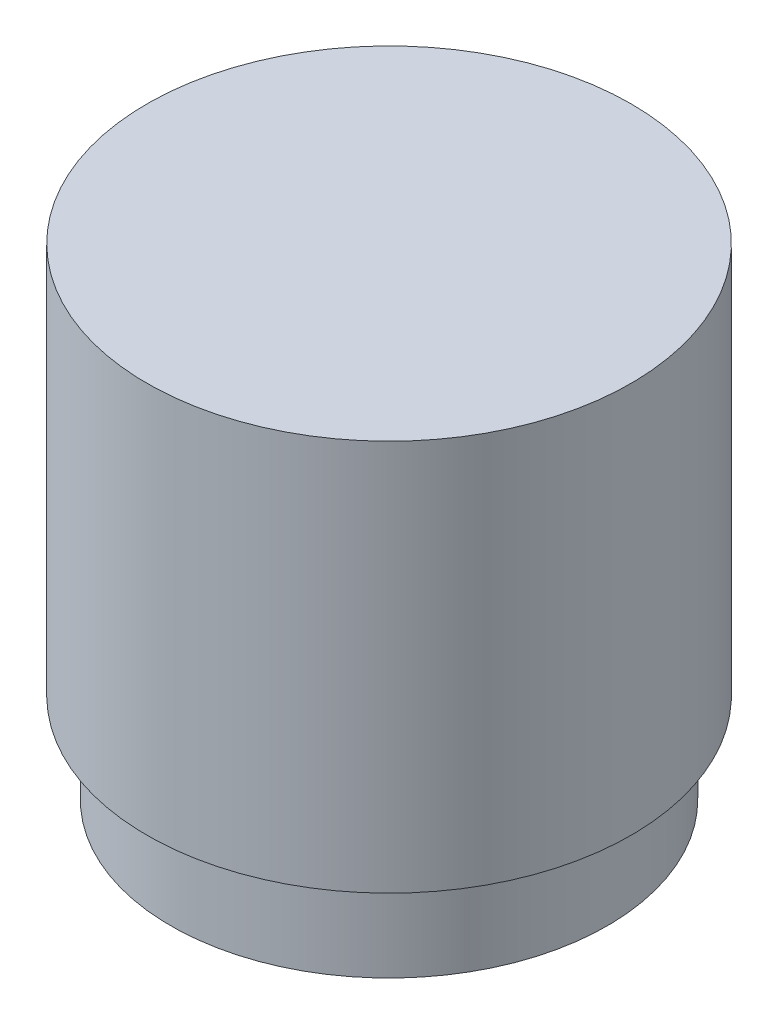
ISO-10303-21;
HEADER;
FILE_DESCRIPTION(('STEP AP214'),'2;1');
FILE_NAME('part.step','',(''),(''),'','','');
FILE_SCHEMA(('AUTOMOTIVE_DESIGN { 1 0 10303 214 1 1 1 1 }'));
ENDSEC;
DATA;
#1=APPLICATION_CONTEXT('core data for automotive mechanical design processes');
#2=APPLICATION_PROTOCOL_DEFINITION('international standard','automotive_design',2000,#1);
#3=PRODUCT_CONTEXT('',#1,'mechanical');
#4=PRODUCT('Part','Part','',(#3));
#5=PRODUCT_RELATED_PRODUCT_CATEGORY('part','',(#4));
#6=PRODUCT_DEFINITION_FORMATION('','',#4);
#7=PRODUCT_DEFINITION_CONTEXT('part definition',#1,'design');
#8=PRODUCT_DEFINITION('design','',#6,#7);
#9=PRODUCT_DEFINITION_SHAPE('','',#8);
#10=(LENGTH_UNIT() NAMED_UNIT(*) SI_UNIT(.MILLI.,.METRE.));
#11=(NAMED_UNIT(*) PLANE_ANGLE_UNIT() SI_UNIT($,.RADIAN.));
#12=(NAMED_UNIT(*) SI_UNIT($,.STERADIAN.) SOLID_ANGLE_UNIT());
#13=UNCERTAINTY_MEASURE_WITH_UNIT(LENGTH_MEASURE(1.E-05),#10,'distance_accuracy_value','');
#14=(GEOMETRIC_REPRESENTATION_CONTEXT(3) GLOBAL_UNCERTAINTY_ASSIGNED_CONTEXT((#13)) GLOBAL_UNIT_ASSIGNED_CONTEXT((#10,
#11,#12)) REPRESENTATION_CONTEXT('',''));
#15=CARTESIAN_POINT('',(0.,0.,0.));
#16=DIRECTION('',(0.,0.,1.));
#17=DIRECTION('',(1.,0.,0.));
#18=AXIS2_PLACEMENT_3D('',#15,#16,#17);
#19=CARTESIAN_POINT('',(-6.375,0.,0.));
#20=DIRECTION('',(0.,1.,0.));
#21=DIRECTION('',(0.,0.,1.));
#22=AXIS2_PLACEMENT_3D('',#19,#20,#21);
#23=PLANE('',#22);
#24=CARTESIAN_POINT('',(0.,0.,0.));
#25=DIRECTION('',(0.,-1.,0.));
#26=DIRECTION('',(0.,0.,-1.));
#27=AXIS2_PLACEMENT_3D('',#24,#25,#26);
#28=CIRCLE('',#27,6.375);
#29=CARTESIAN_POINT('',(0.,0.,-6.375));
#30=VERTEX_POINT('',#29);
#31=EDGE_CURVE('E59',#30,#30,#28,.T.);
#32=ORIENTED_EDGE('',*,*,#31,.F.);
#33=EDGE_LOOP('',(#32));
#34=FACE_BOUND('',#33,.T.);
#35=CARTESIAN_POINT('',(0.,0.,0.));
#36=DIRECTION('',(0.,-1.,0.));
#37=DIRECTION('',(0.,0.,-1.));
#38=AXIS2_PLACEMENT_3D('',#35,#36,#37);
#39=CIRCLE('',#38,7.25);
#40=CARTESIAN_POINT('',(0.,0.,-7.25));
#41=VERTEX_POINT('',#40);
#42=EDGE_CURVE('E10',#41,#41,#39,.T.);
#43=ORIENTED_EDGE('',*,*,#42,.T.);
#44=EDGE_LOOP('',(#43));
#45=FACE_BOUND('',#44,.T.);
#46=ADVANCED_FACE('F31',(#34,#45),#23,.F.);
#47=CARTESIAN_POINT('',(0.,0.,0.));
#48=DIRECTION('',(0.,-1.,0.));
#49=DIRECTION('',(0.,0.,-1.));
#50=AXIS2_PLACEMENT_3D('',#47,#48,#49);
#51=CYLINDRICAL_SURFACE('',#50,7.25);
#52=ORIENTED_EDGE('',*,*,#42,.F.);
#53=EDGE_LOOP('',(#52));
#54=FACE_BOUND('',#53,.T.);
#55=CARTESIAN_POINT('',(0.,3.,0.));
#56=DIRECTION('',(0.,-1.,0.));
#57=DIRECTION('',(0.,0.,-1.));
#58=AXIS2_PLACEMENT_3D('',#55,#56,#57);
#59=CIRCLE('',#58,7.25);
#60=CARTESIAN_POINT('',(0.,3.,-7.25));
#61=VERTEX_POINT('',#60);
#62=EDGE_CURVE('E37',#61,#61,#59,.T.);
#63=ORIENTED_EDGE('',*,*,#62,.T.);
#64=EDGE_LOOP('',(#63));
#65=FACE_BOUND('',#64,.T.);
#66=ADVANCED_FACE('F66',(#54,#65),#51,.T.);
#67=CARTESIAN_POINT('',(-7.25,3.,0.));
#68=DIRECTION('',(0.,1.,0.));
#69=DIRECTION('',(0.,0.,1.));
#70=AXIS2_PLACEMENT_3D('',#67,#68,#69);
#71=PLANE('',#70);
#72=ORIENTED_EDGE('',*,*,#62,.F.);
#73=EDGE_LOOP('',(#72));
#74=FACE_BOUND('',#73,.T.);
#75=CARTESIAN_POINT('',(0.,3.,0.));
#76=DIRECTION('',(0.,-1.,0.));
#77=DIRECTION('',(0.,0.,-1.));
#78=AXIS2_PLACEMENT_3D('',#75,#76,#77);
#79=CIRCLE('',#78,8.04);
#80=CARTESIAN_POINT('',(0.,3.,-8.04));
#81=VERTEX_POINT('',#80);
#82=EDGE_CURVE('E41',#81,#81,#79,.T.);
#83=ORIENTED_EDGE('',*,*,#82,.T.);
#84=EDGE_LOOP('',(#83));
#85=FACE_BOUND('',#84,.T.);
#86=ADVANCED_FACE('F70',(#74,#85),#71,.F.);
#87=CARTESIAN_POINT('',(0.,0.,0.));
#88=DIRECTION('',(0.,-1.,0.));
#89=DIRECTION('',(0.,0.,-1.));
#90=AXIS2_PLACEMENT_3D('',#87,#88,#89);
#91=CYLINDRICAL_SURFACE('',#90,8.04);
#92=ORIENTED_EDGE('',*,*,#82,.F.);
#93=EDGE_LOOP('',(#92));
#94=FACE_BOUND('',#93,.T.);
#95=CARTESIAN_POINT('',(0.,16.,0.));
#96=DIRECTION('',(0.,-1.,0.));
#97=DIRECTION('',(0.,0.,-1.));
#98=AXIS2_PLACEMENT_3D('',#95,#96,#97);
#99=CIRCLE('',#98,8.04);
#100=CARTESIAN_POINT('',(0.,16.,-8.04));
#101=VERTEX_POINT('',#100);
#102=EDGE_CURVE('E45',#101,#101,#99,.T.);
#103=ORIENTED_EDGE('',*,*,#102,.T.);
#104=EDGE_LOOP('',(#103));
#105=FACE_BOUND('',#104,.T.);
#106=ADVANCED_FACE('F75',(#94,#105),#91,.T.);
#107=CARTESIAN_POINT('',(-8.04,16.,0.));
#108=DIRECTION('',(0.,-1.,0.));
#109=DIRECTION('',(0.,0.,-1.));
#110=AXIS2_PLACEMENT_3D('',#107,#108,#109);
#111=PLANE('',#110);
#112=ORIENTED_EDGE('',*,*,#102,.F.);
#113=EDGE_LOOP('',(#112));
#114=FACE_BOUND('',#113,.T.);
#115=ADVANCED_FACE('F81',(#114),#111,.F.);
#116=CARTESIAN_POINT('',(0.,13.57,0.));
#117=DIRECTION('',(0.,1.,0.));
#118=DIRECTION('',(0.,0.,1.));
#119=AXIS2_PLACEMENT_3D('',#116,#117,#118);
#120=PLANE('',#119);
#121=CARTESIAN_POINT('',(0.,13.57,0.));
#122=DIRECTION('',(0.,-1.,0.));
#123=DIRECTION('',(0.,0.,-1.));
#124=AXIS2_PLACEMENT_3D('',#121,#122,#123);
#125=CIRCLE('',#124,2.91);
#126=CARTESIAN_POINT('',(0.,13.57,-2.91));
#127=VERTEX_POINT('',#126);
#128=EDGE_CURVE('E50',#127,#127,#125,.T.);
#129=ORIENTED_EDGE('',*,*,#128,.T.);
#130=EDGE_LOOP('',(#129));
#131=FACE_BOUND('',#130,.T.);
#132=ADVANCED_FACE('F85',(#131),#120,.F.);
#133=CARTESIAN_POINT('',(0.,0.,0.));
#134=DIRECTION('',(0.,-1.,0.));
#135=DIRECTION('',(0.,0.,-1.));
#136=AXIS2_PLACEMENT_3D('',#133,#134,#135);
#137=CYLINDRICAL_SURFACE('',#136,2.91);
#138=ORIENTED_EDGE('',*,*,#128,.F.);
#139=EDGE_LOOP('',(#138));
#140=FACE_BOUND('',#139,.T.);
#141=CARTESIAN_POINT('',(0.,4.3,0.));
#142=DIRECTION('',(0.,-1.,0.));
#143=DIRECTION('',(0.,0.,-1.));
#144=AXIS2_PLACEMENT_3D('',#141,#142,#143);
#145=CIRCLE('',#144,2.91);
#146=CARTESIAN_POINT('',(0.,4.3,-2.91));
#147=VERTEX_POINT('',#146);
#148=EDGE_CURVE('E53',#147,#147,#145,.T.);
#149=ORIENTED_EDGE('',*,*,#148,.T.);
#150=EDGE_LOOP('',(#149));
#151=FACE_BOUND('',#150,.T.);
#152=ADVANCED_FACE('F89',(#140,#151),#137,.F.);
#153=CARTESIAN_POINT('',(-2.91,4.3,0.));
#154=DIRECTION('',(0.,1.,0.));
#155=DIRECTION('',(0.,0.,1.));
#156=AXIS2_PLACEMENT_3D('',#153,#154,#155);
#157=PLANE('',#156);
#158=ORIENTED_EDGE('',*,*,#148,.F.);
#159=EDGE_LOOP('',(#158));
#160=FACE_BOUND('',#159,.T.);
#161=CARTESIAN_POINT('',(0.,4.3,0.));
#162=DIRECTION('',(0.,-1.,0.));
#163=DIRECTION('',(0.,0.,-1.));
#164=AXIS2_PLACEMENT_3D('',#161,#162,#163);
#165=CIRCLE('',#164,6.375);
#166=CARTESIAN_POINT('',(0.,4.3,-6.375));
#167=VERTEX_POINT('',#166);
#168=EDGE_CURVE('E56',#167,#167,#165,.T.);
#169=ORIENTED_EDGE('',*,*,#168,.T.);
#170=EDGE_LOOP('',(#169));
#171=FACE_BOUND('',#170,.T.);
#172=ADVANCED_FACE('F93',(#160,#171),#157,.F.);
#173=CARTESIAN_POINT('',(0.,0.,0.));
#174=DIRECTION('',(0.,-1.,0.));
#175=DIRECTION('',(0.,0.,-1.));
#176=AXIS2_PLACEMENT_3D('',#173,#174,#175);
#177=CYLINDRICAL_SURFACE('',#176,6.375);
#178=ORIENTED_EDGE('',*,*,#168,.F.);
#179=EDGE_LOOP('',(#178));
#180=FACE_BOUND('',#179,.T.);
#181=ORIENTED_EDGE('',*,*,#31,.T.);
#182=EDGE_LOOP('',(#181));
#183=FACE_BOUND('',#182,.T.);
#184=ADVANCED_FACE('F63',(#180,#183),#177,.F.);
#185=CLOSED_SHELL('',(#46,#66,#86,#106,#115,#132,#152,#172,#184));
#186=MANIFOLD_SOLID_BREP('B2',#185);
#187=ADVANCED_BREP_SHAPE_REPRESENTATION('',(#18,#186),#14);
#188=SHAPE_DEFINITION_REPRESENTATION(#9,#187);
ENDSEC;
END-ISO-10303-21;
